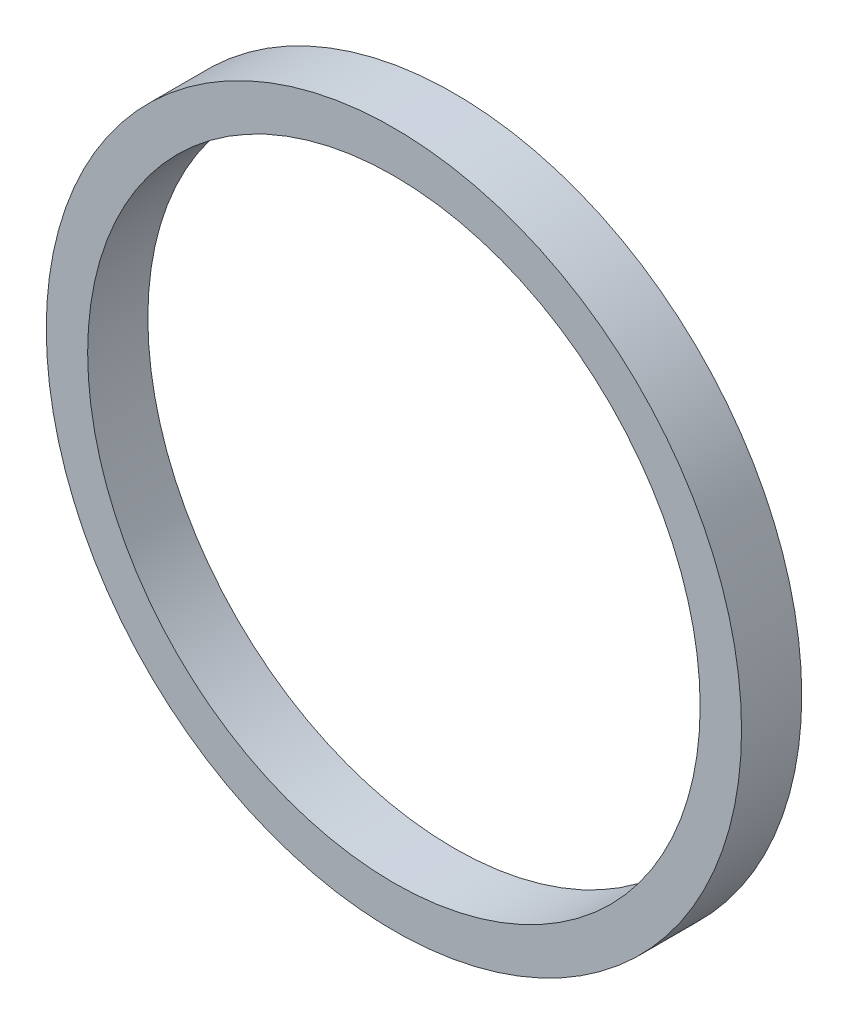
ISO-10303-21;
HEADER;
FILE_DESCRIPTION(('STEP AP214'),'2;1');
FILE_NAME('part.step','',(''),(''),'','','');
FILE_SCHEMA(('AUTOMOTIVE_DESIGN { 1 0 10303 214 1 1 1 1 }'));
ENDSEC;
DATA;
#1=APPLICATION_CONTEXT('core data for automotive mechanical design processes');
#2=APPLICATION_PROTOCOL_DEFINITION('international standard','automotive_design',2000,#1);
#3=PRODUCT_CONTEXT('',#1,'mechanical');
#4=PRODUCT('Part','Part','',(#3));
#5=PRODUCT_RELATED_PRODUCT_CATEGORY('part','',(#4));
#6=PRODUCT_DEFINITION_FORMATION('','',#4);
#7=PRODUCT_DEFINITION_CONTEXT('part definition',#1,'design');
#8=PRODUCT_DEFINITION('design','',#6,#7);
#9=PRODUCT_DEFINITION_SHAPE('','',#8);
#10=(LENGTH_UNIT() NAMED_UNIT(*) SI_UNIT(.MILLI.,.METRE.));
#11=(NAMED_UNIT(*) PLANE_ANGLE_UNIT() SI_UNIT($,.RADIAN.));
#12=(NAMED_UNIT(*) SI_UNIT($,.STERADIAN.) SOLID_ANGLE_UNIT());
#13=UNCERTAINTY_MEASURE_WITH_UNIT(LENGTH_MEASURE(1.E-05),#10,'distance_accuracy_value','');
#14=(GEOMETRIC_REPRESENTATION_CONTEXT(3) GLOBAL_UNCERTAINTY_ASSIGNED_CONTEXT((#13)) GLOBAL_UNIT_ASSIGNED_CONTEXT((#10,
#11,#12)) REPRESENTATION_CONTEXT('',''));
#15=CARTESIAN_POINT('',(0.,0.,0.));
#16=DIRECTION('',(0.,0.,1.));
#17=DIRECTION('',(1.,0.,0.));
#18=AXIS2_PLACEMENT_3D('',#15,#16,#17);
#19=CARTESIAN_POINT('',(0.,0.,1.));
#20=DIRECTION('',(0.,0.,1.));
#21=DIRECTION('',(1.,0.,0.));
#22=AXIS2_PLACEMENT_3D('',#19,#20,#21);
#23=PLANE('',#22);
#24=CARTESIAN_POINT('',(0.,0.,1.));
#25=DIRECTION('',(0.,0.,1.));
#26=DIRECTION('',(1.,0.,0.));
#27=AXIS2_PLACEMENT_3D('',#24,#25,#26);
#28=CIRCLE('',#27,5.775);
#29=CARTESIAN_POINT('',(5.775,0.,1.));
#30=VERTEX_POINT('',#29);
#31=EDGE_CURVE('E10',#30,#30,#28,.T.);
#32=ORIENTED_EDGE('',*,*,#31,.T.);
#33=EDGE_LOOP('',(#32));
#34=FACE_BOUND('',#33,.T.);
#35=CARTESIAN_POINT('',(0.,0.,1.));
#36=DIRECTION('',(0.,0.,1.));
#37=DIRECTION('',(1.,0.,0.));
#38=AXIS2_PLACEMENT_3D('',#35,#36,#37);
#39=CIRCLE('',#38,5.0875);
#40=CARTESIAN_POINT('',(5.0875,0.,1.));
#41=VERTEX_POINT('',#40);
#42=EDGE_CURVE('E48',#41,#41,#39,.T.);
#43=ORIENTED_EDGE('',*,*,#42,.F.);
#44=EDGE_LOOP('',(#43));
#45=FACE_BOUND('',#44,.T.);
#46=ADVANCED_FACE('F37',(#34,#45),#23,.T.);
#47=CARTESIAN_POINT('',(0.,0.,0.));
#48=DIRECTION('',(0.,0.,1.));
#49=DIRECTION('',(1.,0.,0.));
#50=AXIS2_PLACEMENT_3D('',#47,#48,#49);
#51=PLANE('',#50);
#52=CARTESIAN_POINT('',(0.,0.,0.));
#53=DIRECTION('',(0.,0.,1.));
#54=DIRECTION('',(1.,0.,0.));
#55=AXIS2_PLACEMENT_3D('',#52,#53,#54);
#56=CIRCLE('',#55,5.775);
#57=CARTESIAN_POINT('',(5.775,0.,0.));
#58=VERTEX_POINT('',#57);
#59=EDGE_CURVE('E41',#58,#58,#56,.T.);
#60=ORIENTED_EDGE('',*,*,#59,.F.);
#61=EDGE_LOOP('',(#60));
#62=FACE_BOUND('',#61,.T.);
#63=CARTESIAN_POINT('',(0.,0.,0.));
#64=DIRECTION('',(0.,0.,1.));
#65=DIRECTION('',(1.,0.,0.));
#66=AXIS2_PLACEMENT_3D('',#63,#64,#65);
#67=CIRCLE('',#66,5.0875);
#68=CARTESIAN_POINT('',(5.0875,0.,0.));
#69=VERTEX_POINT('',#68);
#70=EDGE_CURVE('E50',#69,#69,#67,.T.);
#71=ORIENTED_EDGE('',*,*,#70,.T.);
#72=EDGE_LOOP('',(#71));
#73=FACE_BOUND('',#72,.T.);
#74=ADVANCED_FACE('F60',(#62,#73),#51,.F.);
#75=CARTESIAN_POINT('',(0.,0.,1.));
#76=DIRECTION('',(0.,0.,-1.));
#77=DIRECTION('',(-1.,0.,0.));
#78=AXIS2_PLACEMENT_3D('',#75,#76,#77);
#79=CYLINDRICAL_SURFACE('',#78,5.775);
#80=ORIENTED_EDGE('',*,*,#31,.F.);
#81=EDGE_LOOP('',(#80));
#82=FACE_BOUND('',#81,.T.);
#83=ORIENTED_EDGE('',*,*,#59,.T.);
#84=EDGE_LOOP('',(#83));
#85=FACE_BOUND('',#84,.T.);
#86=ADVANCED_FACE('F39',(#82,#85),#79,.T.);
#87=CARTESIAN_POINT('',(0.,0.,1.));
#88=DIRECTION('',(0.,0.,-1.));
#89=DIRECTION('',(-1.,0.,0.));
#90=AXIS2_PLACEMENT_3D('',#87,#88,#89);
#91=CYLINDRICAL_SURFACE('',#90,5.0875);
#92=ORIENTED_EDGE('',*,*,#42,.T.);
#93=EDGE_LOOP('',(#92));
#94=FACE_BOUND('',#93,.T.);
#95=ORIENTED_EDGE('',*,*,#70,.F.);
#96=EDGE_LOOP('',(#95));
#97=FACE_BOUND('',#96,.T.);
#98=ADVANCED_FACE('F56',(#94,#97),#91,.F.);
#99=CLOSED_SHELL('',(#46,#74,#86,#98));
#100=MANIFOLD_SOLID_BREP('B2',#99);
#101=ADVANCED_BREP_SHAPE_REPRESENTATION('',(#18,#100),#14);
#102=SHAPE_DEFINITION_REPRESENTATION(#9,#101);
ENDSEC;
END-ISO-10303-21;
